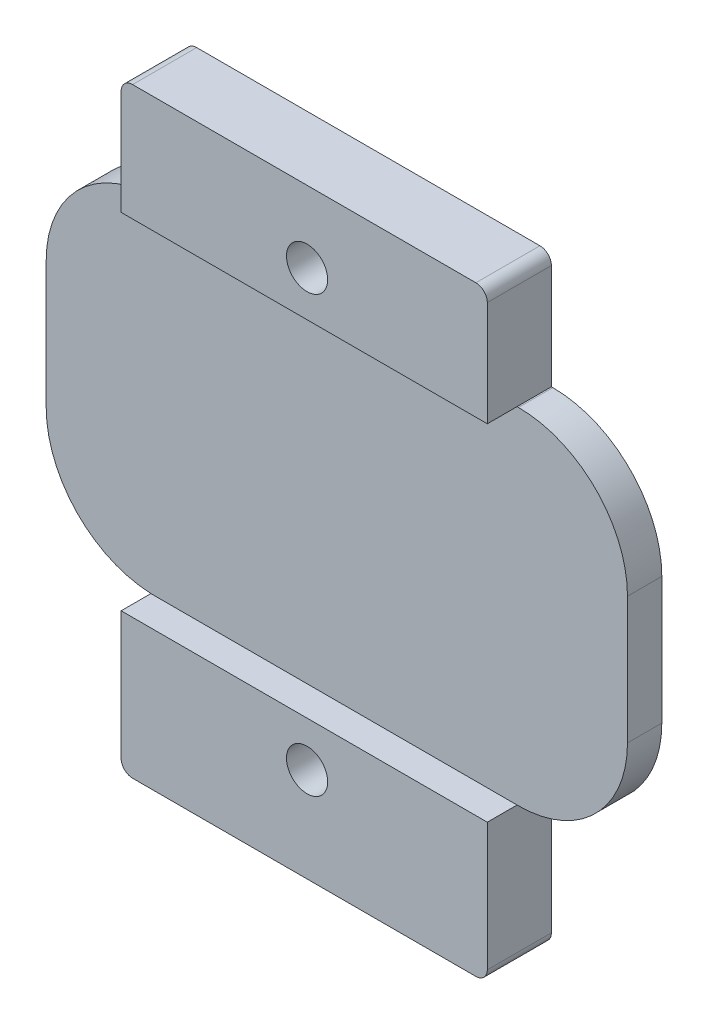
ISO-10303-21;
HEADER;
FILE_DESCRIPTION(('STEP AP214'),'2;1');
FILE_NAME('part.step','',(''),(''),'','','');
FILE_SCHEMA(('AUTOMOTIVE_DESIGN { 1 0 10303 214 1 1 1 1 }'));
ENDSEC;
DATA;
#1=APPLICATION_CONTEXT('core data for automotive mechanical design processes');
#2=APPLICATION_PROTOCOL_DEFINITION('international standard','automotive_design',2000,#1);
#3=PRODUCT_CONTEXT('',#1,'mechanical');
#4=PRODUCT('Part','Part','',(#3));
#5=PRODUCT_RELATED_PRODUCT_CATEGORY('part','',(#4));
#6=PRODUCT_DEFINITION_FORMATION('','',#4);
#7=PRODUCT_DEFINITION_CONTEXT('part definition',#1,'design');
#8=PRODUCT_DEFINITION('design','',#6,#7);
#9=PRODUCT_DEFINITION_SHAPE('','',#8);
#10=(LENGTH_UNIT() NAMED_UNIT(*) SI_UNIT(.MILLI.,.METRE.));
#11=(NAMED_UNIT(*) PLANE_ANGLE_UNIT() SI_UNIT($,.RADIAN.));
#12=(NAMED_UNIT(*) SI_UNIT($,.STERADIAN.) SOLID_ANGLE_UNIT());
#13=UNCERTAINTY_MEASURE_WITH_UNIT(LENGTH_MEASURE(1.E-05),#10,'distance_accuracy_value','');
#14=(GEOMETRIC_REPRESENTATION_CONTEXT(3) GLOBAL_UNCERTAINTY_ASSIGNED_CONTEXT((#13)) GLOBAL_UNIT_ASSIGNED_CONTEXT((#10,
#11,#12)) REPRESENTATION_CONTEXT('',''));
#15=CARTESIAN_POINT('',(0.,0.,0.));
#16=DIRECTION('',(0.,0.,1.));
#17=DIRECTION('',(1.,0.,0.));
#18=AXIS2_PLACEMENT_3D('',#15,#16,#17);
#19=CARTESIAN_POINT('',(-16.2500000005332,12.2500000007962,3.));
#20=DIRECTION('',(1.,0.,0.));
#21=DIRECTION('',(0.,0.,-1.));
#22=AXIS2_PLACEMENT_3D('',#19,#20,#21);
#23=PLANE('',#22);
#24=DIRECTION('',(0.,-1.,0.));
#25=VECTOR('',#24,1.);
#26=CARTESIAN_POINT('',(-16.2500000005332,12.2500000007962,3.));
#27=LINE('',#26,#25);
#28=CARTESIAN_POINT('',(-16.2500000005332,-27.0676152467134,3.));
#29=VERTEX_POINT('',#28);
#30=CARTESIAN_POINT('',(-16.2500000005332,-27.0749999992052,3.));
#31=VERTEX_POINT('',#30);
#32=EDGE_CURVE('E52',#29,#31,#27,.T.);
#33=ORIENTED_EDGE('',*,*,#32,.F.);
#34=DIRECTION('',(0.,0.,1.));
#35=VECTOR('',#34,1.);
#36=CARTESIAN_POINT('',(-16.2500000005332,-27.0676152467134,-59.073263326483));
#37=LINE('',#36,#35);
#38=CARTESIAN_POINT('',(-16.2500000005332,-27.0676152467134,0.));
#39=VERTEX_POINT('',#38);
#40=EDGE_CURVE('E246',#29,#39,#37,.F.);
#41=ORIENTED_EDGE('',*,*,#40,.T.);
#42=DIRECTION('',(0.,-1.,0.));
#43=VECTOR('',#42,1.);
#44=CARTESIAN_POINT('',(-16.2500000005332,12.2500000007962,0.));
#45=LINE('',#44,#43);
#46=CARTESIAN_POINT('',(-16.2500000005332,-38.2499999992031,0.));
#47=VERTEX_POINT('',#46);
#48=EDGE_CURVE('E310',#39,#47,#45,.T.);
#49=ORIENTED_EDGE('',*,*,#48,.T.);
#50=DIRECTION('',(0.,0.,-1.));
#51=VECTOR('',#50,1.);
#52=CARTESIAN_POINT('',(-16.2500000005332,-38.2499999992031,3.));
#53=LINE('',#52,#51);
#54=CARTESIAN_POINT('',(-16.2500000005332,-38.2499999992031,5.6));
#55=VERTEX_POINT('',#54);
#56=EDGE_CURVE('E333',#55,#47,#53,.T.);
#57=ORIENTED_EDGE('',*,*,#56,.F.);
#58=DIRECTION('',(0.,-1.,0.));
#59=VECTOR('',#58,1.);
#60=CARTESIAN_POINT('',(-16.2500000005332,-27.0749999992052,5.6));
#61=LINE('',#60,#59);
#62=CARTESIAN_POINT('',(-16.2500000005332,-27.0749999992052,5.6));
#63=VERTEX_POINT('',#62);
#64=EDGE_CURVE('E264',#63,#55,#61,.T.);
#65=ORIENTED_EDGE('',*,*,#64,.F.);
#66=DIRECTION('',(0.,0.,-1.));
#67=VECTOR('',#66,1.);
#68=CARTESIAN_POINT('',(-16.2500000005332,-27.0749999992052,5.6));
#69=LINE('',#68,#67);
#70=EDGE_CURVE('E267',#63,#31,#69,.T.);
#71=ORIENTED_EDGE('',*,*,#70,.T.);
#72=EDGE_LOOP('',(#33,#41,#49,#57,#65,#71));
#73=FACE_BOUND('',#72,.T.);
#74=ADVANCED_FACE('F35',(#73),#23,.F.);
#75=CARTESIAN_POINT('',(15.75,12.2500000007962,3.));
#76=DIRECTION('',(-1.,0.,0.));
#77=DIRECTION('',(0.,0.,1.));
#78=AXIS2_PLACEMENT_3D('',#75,#76,#77);
#79=PLANE('',#78);
#80=DIRECTION('',(0.,1.,0.));
#81=VECTOR('',#80,1.);
#82=CARTESIAN_POINT('',(15.75,12.2500000007962,0.));
#83=LINE('',#82,#81);
#84=CARTESIAN_POINT('',(15.75,-38.2499999992031,0.));
#85=VERTEX_POINT('',#84);
#86=CARTESIAN_POINT('',(15.75,-27.0749999992052,0.));
#87=VERTEX_POINT('',#86);
#88=EDGE_CURVE('E320',#85,#87,#83,.T.);
#89=ORIENTED_EDGE('',*,*,#88,.T.);
#90=DIRECTION('',(0.,0.,1.));
#91=VECTOR('',#90,1.);
#92=CARTESIAN_POINT('',(15.75,-27.0749999992052,3.));
#93=LINE('',#92,#91);
#94=CARTESIAN_POINT('',(15.75,-27.0749999992052,3.));
#95=VERTEX_POINT('',#94);
#96=EDGE_CURVE('E248',#87,#95,#93,.T.);
#97=ORIENTED_EDGE('',*,*,#96,.T.);
#98=DIRECTION('',(0.,0.,-1.));
#99=VECTOR('',#98,1.);
#100=CARTESIAN_POINT('',(15.75,-27.0749999992052,5.6));
#101=LINE('',#100,#99);
#102=CARTESIAN_POINT('',(15.75,-27.0749999992052,5.6));
#103=VERTEX_POINT('',#102);
#104=EDGE_CURVE('E270',#103,#95,#101,.T.);
#105=ORIENTED_EDGE('',*,*,#104,.F.);
#106=DIRECTION('',(0.,1.,0.));
#107=VECTOR('',#106,1.);
#108=CARTESIAN_POINT('',(15.75,-38.2499999992031,5.6));
#109=LINE('',#108,#107);
#110=CARTESIAN_POINT('',(15.75,-38.2499999992031,5.6));
#111=VERTEX_POINT('',#110);
#112=EDGE_CURVE('E260',#111,#103,#109,.T.);
#113=ORIENTED_EDGE('',*,*,#112,.F.);
#114=DIRECTION('',(0.,0.,-1.));
#115=VECTOR('',#114,1.);
#116=CARTESIAN_POINT('',(15.75,-38.2499999992031,3.));
#117=LINE('',#116,#115);
#118=EDGE_CURVE('E324',#111,#85,#117,.T.);
#119=ORIENTED_EDGE('',*,*,#118,.T.);
#120=EDGE_LOOP('',(#89,#97,#105,#113,#119));
#121=FACE_BOUND('',#120,.T.);
#122=ADVANCED_FACE('F384',(#121),#79,.F.);
#123=CARTESIAN_POINT('',(14.75,12.2500000007962,3.));
#124=DIRECTION('',(0.,0.,1.));
#125=DIRECTION('',(1.,0.,0.));
#126=AXIS2_PLACEMENT_3D('',#123,#124,#125);
#127=PLANE('',#126);
#128=CARTESIAN_POINT('',(-16.2500000005332,3.07500000079476,3.));
#129=VERTEX_POINT('',#128);
#130=CARTESIAN_POINT('',(-16.2500000005332,3.06741524830296,3.));
#131=VERTEX_POINT('',#130);
#132=EDGE_CURVE('E299',#129,#131,#27,.T.);
#133=ORIENTED_EDGE('',*,*,#132,.T.);
#134=CARTESIAN_POINT('',(-15.875,-6.45019999920521,3.));
#135=DIRECTION('',(0.,0.,1.));
#136=DIRECTION('',(1.,0.,0.));
#137=AXIS2_PLACEMENT_3D('',#134,#135,#136);
#138=CIRCLE('',#137,9.52499999999999);
#139=CARTESIAN_POINT('',(-25.4,-6.45019999920524,3.));
#140=VERTEX_POINT('',#139);
#141=EDGE_CURVE('E207',#131,#140,#138,.T.);
#142=ORIENTED_EDGE('',*,*,#141,.T.);
#143=DIRECTION('',(0.,-1.,0.));
#144=VECTOR('',#143,1.);
#145=CARTESIAN_POINT('',(-25.4,-6.45019999920524,3.));
#146=LINE('',#145,#144);
#147=CARTESIAN_POINT('',(-25.4,-17.5499999992052,3.));
#148=VERTEX_POINT('',#147);
#149=EDGE_CURVE('E219',#140,#148,#146,.T.);
#150=ORIENTED_EDGE('',*,*,#149,.T.);
#151=CARTESIAN_POINT('',(-15.875,-17.5499999992052,3.));
#152=DIRECTION('',(0.,0.,1.));
#153=DIRECTION('',(1.,0.,0.));
#154=AXIS2_PLACEMENT_3D('',#151,#152,#153);
#155=CIRCLE('',#154,9.52499999999998);
#156=EDGE_CURVE('E222',#148,#29,#155,.T.);
#157=ORIENTED_EDGE('',*,*,#156,.T.);
#158=ORIENTED_EDGE('',*,*,#32,.T.);
#159=DIRECTION('',(-1.,0.,0.));
#160=VECTOR('',#159,1.);
#161=CARTESIAN_POINT('',(-16.2500000005332,-27.0749999992052,3.));
#162=LINE('',#161,#160);
#163=EDGE_CURVE('E250',#95,#31,#162,.T.);
#164=ORIENTED_EDGE('',*,*,#163,.F.);
#165=DIRECTION('',(1.,0.,0.));
#166=VECTOR('',#165,1.);
#167=CARTESIAN_POINT('',(14.7319999999999,-27.0749999992052,3.));
#168=LINE('',#167,#166);
#169=CARTESIAN_POINT('',(15.875,-27.0749999992052,3.));
#170=VERTEX_POINT('',#169);
#171=EDGE_CURVE('E225',#95,#170,#168,.T.);
#172=ORIENTED_EDGE('',*,*,#171,.T.);
#173=CARTESIAN_POINT('',(15.8749999999999,-17.5499999992052,3.));
#174=DIRECTION('',(0.,0.,1.));
#175=DIRECTION('',(1.,0.,0.));
#176=AXIS2_PLACEMENT_3D('',#173,#174,#175);
#177=CIRCLE('',#176,9.52500000000004);
#178=CARTESIAN_POINT('',(25.4,-17.5499999992052,3.));
#179=VERTEX_POINT('',#178);
#180=EDGE_CURVE('E227',#170,#179,#177,.T.);
#181=ORIENTED_EDGE('',*,*,#180,.T.);
#182=DIRECTION('',(0.,1.,0.));
#183=VECTOR('',#182,1.);
#184=CARTESIAN_POINT('',(25.4,-17.5499999992052,3.));
#185=LINE('',#184,#183);
#186=CARTESIAN_POINT('',(25.4,-6.45019999920519,3.));
#187=VERTEX_POINT('',#186);
#188=EDGE_CURVE('E198',#179,#187,#185,.T.);
#189=ORIENTED_EDGE('',*,*,#188,.T.);
#190=CARTESIAN_POINT('',(15.875,-6.45019999920518,3.));
#191=DIRECTION('',(0.,0.,1.));
#192=DIRECTION('',(1.,0.,0.));
#193=AXIS2_PLACEMENT_3D('',#190,#191,#192);
#194=CIRCLE('',#193,9.52499999999999);
#195=CARTESIAN_POINT('',(15.875,3.0748000007948,3.));
#196=VERTEX_POINT('',#195);
#197=EDGE_CURVE('E192',#187,#196,#194,.T.);
#198=ORIENTED_EDGE('',*,*,#197,.T.);
#199=DIRECTION('',(-1.,0.,0.));
#200=VECTOR('',#199,1.);
#201=CARTESIAN_POINT('',(-14.7320000000001,3.07480000079479,3.));
#202=LINE('',#201,#200);
#203=CARTESIAN_POINT('',(15.75,3.07480000079484,3.));
#204=VERTEX_POINT('',#203);
#205=EDGE_CURVE('E202',#196,#204,#202,.T.);
#206=ORIENTED_EDGE('',*,*,#205,.T.);
#207=DIRECTION('',(0.,1.,0.));
#208=VECTOR('',#207,1.);
#209=CARTESIAN_POINT('',(15.75,12.2500000007962,3.));
#210=LINE('',#209,#208);
#211=CARTESIAN_POINT('',(15.75,3.07500000079476,3.));
#212=VERTEX_POINT('',#211);
#213=EDGE_CURVE('E301',#204,#212,#210,.T.);
#214=ORIENTED_EDGE('',*,*,#213,.T.);
#215=DIRECTION('',(1.,0.,0.));
#216=VECTOR('',#215,1.);
#217=CARTESIAN_POINT('',(-16.2500000005332,3.07500000079476,3.));
#218=LINE('',#217,#216);
#219=EDGE_CURVE('E273',#129,#212,#218,.T.);
#220=ORIENTED_EDGE('',*,*,#219,.F.);
#221=EDGE_LOOP('',(#133,#142,#150,#157,#158,#164,#172,#181,#189,#198,#206,#214,#220));
#222=FACE_BOUND('',#221,.T.);
#223=ADVANCED_FACE('F209',(#222),#127,.T.);
#224=CARTESIAN_POINT('',(14.75,12.2500000007962,3.));
#225=DIRECTION('',(0.,0.,-1.));
#226=DIRECTION('',(-1.,0.,0.));
#227=AXIS2_PLACEMENT_3D('',#224,#225,#226);
#228=CYLINDRICAL_SURFACE('',#227,0.999999999999999);
#229=CARTESIAN_POINT('',(14.75,12.2500000007962,0.));
#230=DIRECTION('',(0.,0.,1.));
#231=DIRECTION('',(1.,0.,0.));
#232=AXIS2_PLACEMENT_3D('',#229,#230,#231);
#233=CIRCLE('',#232,0.999999999999999);
#234=CARTESIAN_POINT('',(15.75,12.2500000007962,0.));
#235=VERTEX_POINT('',#234);
#236=CARTESIAN_POINT('',(14.75,13.2500000007962,0.));
#237=VERTEX_POINT('',#236);
#238=EDGE_CURVE('E298',#235,#237,#233,.T.);
#239=ORIENTED_EDGE('',*,*,#238,.T.);
#240=DIRECTION('',(0.,0.,-1.));
#241=VECTOR('',#240,1.);
#242=CARTESIAN_POINT('',(14.75,13.2500000007962,3.));
#243=LINE('',#242,#241);
#244=CARTESIAN_POINT('',(14.75,13.2500000007962,5.6));
#245=VERTEX_POINT('',#244);
#246=EDGE_CURVE('E11',#245,#237,#243,.T.);
#247=ORIENTED_EDGE('',*,*,#246,.F.);
#248=CARTESIAN_POINT('',(14.75,12.2500000007962,5.6));
#249=DIRECTION('',(0.,0.,1.));
#250=DIRECTION('',(1.,0.,0.));
#251=AXIS2_PLACEMENT_3D('',#248,#249,#250);
#252=CIRCLE('',#251,0.999999999999999);
#253=CARTESIAN_POINT('',(15.75,12.2500000007962,5.6));
#254=VERTEX_POINT('',#253);
#255=EDGE_CURVE('E284',#254,#245,#252,.T.);
#256=ORIENTED_EDGE('',*,*,#255,.F.);
#257=DIRECTION('',(0.,0.,-1.));
#258=VECTOR('',#257,1.);
#259=CARTESIAN_POINT('',(15.75,12.2500000007962,3.));
#260=LINE('',#259,#258);
#261=EDGE_CURVE('E303',#254,#235,#260,.T.);
#262=ORIENTED_EDGE('',*,*,#261,.T.);
#263=EDGE_LOOP('',(#239,#247,#256,#262));
#264=FACE_BOUND('',#263,.T.);
#265=ADVANCED_FACE('F37',(#264),#228,.T.);
#266=CARTESIAN_POINT('',(-15.2500000005332,13.2500000007962,3.));
#267=DIRECTION('',(0.,-1.,0.));
#268=DIRECTION('',(0.,0.,-1.));
#269=AXIS2_PLACEMENT_3D('',#266,#267,#268);
#270=PLANE('',#269);
#271=DIRECTION('',(-1.,0.,0.));
#272=VECTOR('',#271,1.);
#273=CARTESIAN_POINT('',(-15.2500000005332,13.2500000007962,0.));
#274=LINE('',#273,#272);
#275=CARTESIAN_POINT('',(-15.2500000005332,13.2500000007962,0.));
#276=VERTEX_POINT('',#275);
#277=EDGE_CURVE('E306',#237,#276,#274,.T.);
#278=ORIENTED_EDGE('',*,*,#277,.T.);
#279=DIRECTION('',(0.,0.,-1.));
#280=VECTOR('',#279,1.);
#281=CARTESIAN_POINT('',(-15.2500000005332,13.2500000007962,3.));
#282=LINE('',#281,#280);
#283=CARTESIAN_POINT('',(-15.2500000005332,13.2500000007962,5.6));
#284=VERTEX_POINT('',#283);
#285=EDGE_CURVE('E44',#284,#276,#282,.T.);
#286=ORIENTED_EDGE('',*,*,#285,.F.);
#287=DIRECTION('',(-1.,0.,0.));
#288=VECTOR('',#287,1.);
#289=CARTESIAN_POINT('',(14.75,13.2500000007962,5.6));
#290=LINE('',#289,#288);
#291=EDGE_CURVE('E287',#245,#284,#290,.T.);
#292=ORIENTED_EDGE('',*,*,#291,.F.);
#293=ORIENTED_EDGE('',*,*,#246,.T.);
#294=EDGE_LOOP('',(#278,#286,#292,#293));
#295=FACE_BOUND('',#294,.T.);
#296=ADVANCED_FACE('F428',(#295),#270,.F.);
#297=CARTESIAN_POINT('',(-15.2500000005332,12.2500000007962,3.));
#298=DIRECTION('',(0.,0.,-1.));
#299=DIRECTION('',(-1.,0.,0.));
#300=AXIS2_PLACEMENT_3D('',#297,#298,#299);
#301=CYLINDRICAL_SURFACE('',#300,0.999999999999999);
#302=CARTESIAN_POINT('',(-15.2500000005332,12.2500000007962,0.));
#303=DIRECTION('',(0.,0.,1.));
#304=DIRECTION('',(-1.,0.,0.));
#305=AXIS2_PLACEMENT_3D('',#302,#303,#304);
#306=CIRCLE('',#305,0.999999999999999);
#307=CARTESIAN_POINT('',(-16.2500000005332,12.2500000007962,0.));
#308=VERTEX_POINT('',#307);
#309=EDGE_CURVE('E308',#276,#308,#306,.T.);
#310=ORIENTED_EDGE('',*,*,#309,.T.);
#311=DIRECTION('',(0.,0.,-1.));
#312=VECTOR('',#311,1.);
#313=CARTESIAN_POINT('',(-16.2500000005332,12.2500000007962,3.));
#314=LINE('',#313,#312);
#315=CARTESIAN_POINT('',(-16.2500000005332,12.2500000007962,5.6));
#316=VERTEX_POINT('',#315);
#317=EDGE_CURVE('E336',#316,#308,#314,.T.);
#318=ORIENTED_EDGE('',*,*,#317,.F.);
#319=CARTESIAN_POINT('',(-15.2500000005332,12.2500000007962,5.6));
#320=DIRECTION('',(0.,0.,1.));
#321=DIRECTION('',(1.,0.,0.));
#322=AXIS2_PLACEMENT_3D('',#319,#320,#321);
#323=CIRCLE('',#322,1.);
#324=EDGE_CURVE('E274',#284,#316,#323,.T.);
#325=ORIENTED_EDGE('',*,*,#324,.F.);
#326=ORIENTED_EDGE('',*,*,#285,.T.);
#327=EDGE_LOOP('',(#310,#318,#325,#326));
#328=FACE_BOUND('',#327,.T.);
#329=ADVANCED_FACE('F425',(#328),#301,.T.);
#330=CARTESIAN_POINT('',(-16.2500000005332,3.06741524830296,0.));
#331=VERTEX_POINT('',#330);
#332=EDGE_CURVE('E311',#308,#331,#45,.T.);
#333=ORIENTED_EDGE('',*,*,#332,.T.);
#334=DIRECTION('',(0.,0.,1.));
#335=VECTOR('',#334,1.);
#336=CARTESIAN_POINT('',(-16.2500000005332,3.06741524830296,-59.073263326483));
#337=LINE('',#336,#335);
#338=EDGE_CURVE('E60',#331,#131,#337,.T.);
#339=ORIENTED_EDGE('',*,*,#338,.T.);
#340=ORIENTED_EDGE('',*,*,#132,.F.);
#341=DIRECTION('',(0.,0.,-1.));
#342=VECTOR('',#341,1.);
#343=CARTESIAN_POINT('',(-16.2500000005332,3.07500000079476,5.6));
#344=LINE('',#343,#342);
#345=CARTESIAN_POINT('',(-16.2500000005332,3.07500000079476,5.6));
#346=VERTEX_POINT('',#345);
#347=EDGE_CURVE('E295',#346,#129,#344,.T.);
#348=ORIENTED_EDGE('',*,*,#347,.F.);
#349=DIRECTION('',(0.,-1.,0.));
#350=VECTOR('',#349,1.);
#351=CARTESIAN_POINT('',(-16.2500000005332,12.2500000007962,5.6));
#352=LINE('',#351,#350);
#353=EDGE_CURVE('E277',#316,#346,#352,.T.);
#354=ORIENTED_EDGE('',*,*,#353,.F.);
#355=ORIENTED_EDGE('',*,*,#317,.T.);
#356=EDGE_LOOP('',(#333,#339,#340,#348,#354,#355));
#357=FACE_BOUND('',#356,.T.);
#358=ADVANCED_FACE('F420',(#357),#23,.F.);
#359=CARTESIAN_POINT('',(-15.2500000005332,-38.2499999992031,3.));
#360=DIRECTION('',(0.,0.,-1.));
#361=DIRECTION('',(-1.,0.,0.));
#362=AXIS2_PLACEMENT_3D('',#359,#360,#361);
#363=CYLINDRICAL_SURFACE('',#362,1.);
#364=CARTESIAN_POINT('',(-15.2500000005332,-38.2499999992031,0.));
#365=DIRECTION('',(0.,0.,1.));
#366=DIRECTION('',(1.,0.,0.));
#367=AXIS2_PLACEMENT_3D('',#364,#365,#366);
#368=CIRCLE('',#367,1.);
#369=CARTESIAN_POINT('',(-15.2500000005332,-39.2499999992031,0.));
#370=VERTEX_POINT('',#369);
#371=EDGE_CURVE('E313',#47,#370,#368,.T.);
#372=ORIENTED_EDGE('',*,*,#371,.T.);
#373=DIRECTION('',(0.,0.,-1.));
#374=VECTOR('',#373,1.);
#375=CARTESIAN_POINT('',(-15.2500000005332,-39.2499999992031,3.));
#376=LINE('',#375,#374);
#377=CARTESIAN_POINT('',(-15.2500000005332,-39.2499999992031,5.6));
#378=VERTEX_POINT('',#377);
#379=EDGE_CURVE('E330',#378,#370,#376,.T.);
#380=ORIENTED_EDGE('',*,*,#379,.F.);
#381=CARTESIAN_POINT('',(-15.2500000005332,-38.2499999992031,5.6));
#382=DIRECTION('',(0.,0.,1.));
#383=DIRECTION('',(1.,0.,0.));
#384=AXIS2_PLACEMENT_3D('',#381,#382,#383);
#385=CIRCLE('',#384,1.);
#386=EDGE_CURVE('E251',#55,#378,#385,.T.);
#387=ORIENTED_EDGE('',*,*,#386,.F.);
#388=ORIENTED_EDGE('',*,*,#56,.T.);
#389=EDGE_LOOP('',(#372,#380,#387,#388));
#390=FACE_BOUND('',#389,.T.);
#391=ADVANCED_FACE('F398',(#390),#363,.T.);
#392=CARTESIAN_POINT('',(14.75,-39.2499999992031,3.));
#393=DIRECTION('',(0.,1.,0.));
#394=DIRECTION('',(-1.,0.,0.));
#395=AXIS2_PLACEMENT_3D('',#392,#393,#394);
#396=PLANE('',#395);
#397=DIRECTION('',(1.,0.,0.));
#398=VECTOR('',#397,1.);
#399=CARTESIAN_POINT('',(14.75,-39.2499999992031,0.));
#400=LINE('',#399,#398);
#401=CARTESIAN_POINT('',(14.75,-39.2499999992031,0.));
#402=VERTEX_POINT('',#401);
#403=EDGE_CURVE('E315',#370,#402,#400,.T.);
#404=ORIENTED_EDGE('',*,*,#403,.T.);
#405=DIRECTION('',(0.,0.,-1.));
#406=VECTOR('',#405,1.);
#407=CARTESIAN_POINT('',(14.75,-39.2499999992031,3.));
#408=LINE('',#407,#406);
#409=CARTESIAN_POINT('',(14.75,-39.2499999992031,5.6));
#410=VERTEX_POINT('',#409);
#411=EDGE_CURVE('E327',#410,#402,#408,.T.);
#412=ORIENTED_EDGE('',*,*,#411,.F.);
#413=DIRECTION('',(1.,0.,0.));
#414=VECTOR('',#413,1.);
#415=CARTESIAN_POINT('',(-15.2500000005332,-39.2499999992031,5.6));
#416=LINE('',#415,#414);
#417=EDGE_CURVE('E254',#378,#410,#416,.T.);
#418=ORIENTED_EDGE('',*,*,#417,.F.);
#419=ORIENTED_EDGE('',*,*,#379,.T.);
#420=EDGE_LOOP('',(#404,#412,#418,#419));
#421=FACE_BOUND('',#420,.T.);
#422=ADVANCED_FACE('F395',(#421),#396,.F.);
#423=CARTESIAN_POINT('',(14.75,-38.2499999992031,3.));
#424=DIRECTION('',(0.,0.,-1.));
#425=DIRECTION('',(-1.,0.,0.));
#426=AXIS2_PLACEMENT_3D('',#423,#424,#425);
#427=CYLINDRICAL_SURFACE('',#426,1.);
#428=CARTESIAN_POINT('',(14.75,-38.2499999992031,0.));
#429=DIRECTION('',(0.,0.,1.));
#430=DIRECTION('',(1.,0.,0.));
#431=AXIS2_PLACEMENT_3D('',#428,#429,#430);
#432=CIRCLE('',#431,1.);
#433=EDGE_CURVE('E317',#402,#85,#432,.T.);
#434=ORIENTED_EDGE('',*,*,#433,.T.);
#435=ORIENTED_EDGE('',*,*,#118,.F.);
#436=CARTESIAN_POINT('',(14.75,-38.2499999992031,5.6));
#437=DIRECTION('',(0.,0.,1.));
#438=DIRECTION('',(1.,0.,0.));
#439=AXIS2_PLACEMENT_3D('',#436,#437,#438);
#440=CIRCLE('',#439,1.);
#441=EDGE_CURVE('E257',#410,#111,#440,.T.);
#442=ORIENTED_EDGE('',*,*,#441,.F.);
#443=ORIENTED_EDGE('',*,*,#411,.T.);
#444=EDGE_LOOP('',(#434,#435,#442,#443));
#445=FACE_BOUND('',#444,.T.);
#446=ADVANCED_FACE('F389',(#445),#427,.T.);
#447=ORIENTED_EDGE('',*,*,#213,.F.);
#448=DIRECTION('',(0.,0.,-1.));
#449=VECTOR('',#448,1.);
#450=CARTESIAN_POINT('',(15.75,3.07480000079479,3.));
#451=LINE('',#450,#449);
#452=CARTESIAN_POINT('',(15.75,3.07480000079479,0.));
#453=VERTEX_POINT('',#452);
#454=EDGE_CURVE('E205',#204,#453,#451,.T.);
#455=ORIENTED_EDGE('',*,*,#454,.T.);
#456=EDGE_CURVE('E319',#453,#235,#83,.T.);
#457=ORIENTED_EDGE('',*,*,#456,.T.);
#458=ORIENTED_EDGE('',*,*,#261,.F.);
#459=DIRECTION('',(0.,1.,0.));
#460=VECTOR('',#459,1.);
#461=CARTESIAN_POINT('',(15.75,3.07500000079476,5.6));
#462=LINE('',#461,#460);
#463=CARTESIAN_POINT('',(15.75,3.07500000079476,5.6));
#464=VERTEX_POINT('',#463);
#465=EDGE_CURVE('E281',#464,#254,#462,.T.);
#466=ORIENTED_EDGE('',*,*,#465,.F.);
#467=DIRECTION('',(0.,0.,-1.));
#468=VECTOR('',#467,1.);
#469=CARTESIAN_POINT('',(15.75,3.07500000079476,5.6));
#470=LINE('',#469,#468);
#471=EDGE_CURVE('E290',#464,#212,#470,.T.);
#472=ORIENTED_EDGE('',*,*,#471,.T.);
#473=EDGE_LOOP('',(#447,#455,#457,#458,#466,#472));
#474=FACE_BOUND('',#473,.T.);
#475=ADVANCED_FACE('F436',(#474),#79,.F.);
#476=CARTESIAN_POINT('',(14.75,12.2500000007962,0.));
#477=DIRECTION('',(0.,0.,1.));
#478=DIRECTION('',(1.,0.,0.));
#479=AXIS2_PLACEMENT_3D('',#476,#477,#478);
#480=PLANE('',#479);
#481=CARTESIAN_POINT('',(0.,6.99999999999999,0.));
#482=DIRECTION('',(0.,0.,1.));
#483=DIRECTION('',(1.,0.,0.));
#484=AXIS2_PLACEMENT_3D('',#481,#482,#483);
#485=CIRCLE('',#484,1.8);
#486=CARTESIAN_POINT('',(1.80000000000002,6.99999999999999,0.));
#487=VERTEX_POINT('',#486);
#488=EDGE_CURVE('E341',#487,#487,#485,.T.);
#489=ORIENTED_EDGE('',*,*,#488,.T.);
#490=EDGE_LOOP('',(#489));
#491=FACE_BOUND('',#490,.T.);
#492=CARTESIAN_POINT('',(0.,-31.,0.));
#493=DIRECTION('',(0.,0.,1.));
#494=DIRECTION('',(1.,0.,0.));
#495=AXIS2_PLACEMENT_3D('',#492,#493,#494);
#496=CIRCLE('',#495,1.8);
#497=CARTESIAN_POINT('',(1.8,-31.,0.));
#498=VERTEX_POINT('',#497);
#499=EDGE_CURVE('E345',#498,#498,#496,.T.);
#500=ORIENTED_EDGE('',*,*,#499,.T.);
#501=EDGE_LOOP('',(#500));
#502=FACE_BOUND('',#501,.T.);
#503=ORIENTED_EDGE('',*,*,#456,.F.);
#504=DIRECTION('',(1.,0.,0.));
#505=VECTOR('',#504,1.);
#506=CARTESIAN_POINT('',(-14.7320000000001,3.07480000079479,0.));
#507=LINE('',#506,#505);
#508=CARTESIAN_POINT('',(15.875,3.07480000079479,0.));
#509=VERTEX_POINT('',#508);
#510=EDGE_CURVE('E242',#453,#509,#507,.T.);
#511=ORIENTED_EDGE('',*,*,#510,.T.);
#512=CARTESIAN_POINT('',(15.875,-6.45019999920518,0.));
#513=DIRECTION('',(0.,0.,1.));
#514=DIRECTION('',(1.,0.,0.));
#515=AXIS2_PLACEMENT_3D('',#512,#513,#514);
#516=CIRCLE('',#515,9.52499999999999);
#517=CARTESIAN_POINT('',(25.4,-6.45019999920519,0.));
#518=VERTEX_POINT('',#517);
#519=EDGE_CURVE('E194',#509,#518,#516,.F.);
#520=ORIENTED_EDGE('',*,*,#519,.T.);
#521=DIRECTION('',(0.,-1.,0.));
#522=VECTOR('',#521,1.);
#523=CARTESIAN_POINT('',(25.4,-17.5499999992052,0.));
#524=LINE('',#523,#522);
#525=CARTESIAN_POINT('',(25.4,-17.5499999992052,0.));
#526=VERTEX_POINT('',#525);
#527=EDGE_CURVE('E362',#518,#526,#524,.T.);
#528=ORIENTED_EDGE('',*,*,#527,.T.);
#529=CARTESIAN_POINT('',(15.8749999999999,-17.5499999992052,0.));
#530=DIRECTION('',(0.,0.,1.));
#531=DIRECTION('',(1.,0.,0.));
#532=AXIS2_PLACEMENT_3D('',#529,#530,#531);
#533=CIRCLE('',#532,9.52500000000004);
#534=CARTESIAN_POINT('',(15.875,-27.0749999992052,0.));
#535=VERTEX_POINT('',#534);
#536=EDGE_CURVE('E361',#526,#535,#533,.F.);
#537=ORIENTED_EDGE('',*,*,#536,.T.);
#538=DIRECTION('',(-1.,0.,0.));
#539=VECTOR('',#538,1.);
#540=CARTESIAN_POINT('',(14.7319999999999,-27.0749999992052,0.));
#541=LINE('',#540,#539);
#542=EDGE_CURVE('E358',#535,#87,#541,.T.);
#543=ORIENTED_EDGE('',*,*,#542,.T.);
#544=ORIENTED_EDGE('',*,*,#88,.F.);
#545=ORIENTED_EDGE('',*,*,#433,.F.);
#546=ORIENTED_EDGE('',*,*,#403,.F.);
#547=ORIENTED_EDGE('',*,*,#371,.F.);
#548=ORIENTED_EDGE('',*,*,#48,.F.);
#549=CARTESIAN_POINT('',(-15.875,-17.5499999992052,0.));
#550=DIRECTION('',(0.,0.,1.));
#551=DIRECTION('',(1.,0.,0.));
#552=AXIS2_PLACEMENT_3D('',#549,#550,#551);
#553=CIRCLE('',#552,9.52499999999998);
#554=CARTESIAN_POINT('',(-25.4,-17.5499999992052,0.));
#555=VERTEX_POINT('',#554);
#556=EDGE_CURVE('E356',#39,#555,#553,.F.);
#557=ORIENTED_EDGE('',*,*,#556,.T.);
#558=DIRECTION('',(0.,1.,0.));
#559=VECTOR('',#558,1.);
#560=CARTESIAN_POINT('',(-25.4,-6.45019999920524,0.));
#561=LINE('',#560,#559);
#562=CARTESIAN_POINT('',(-25.4,-6.45019999920524,0.));
#563=VERTEX_POINT('',#562);
#564=EDGE_CURVE('E354',#555,#563,#561,.T.);
#565=ORIENTED_EDGE('',*,*,#564,.T.);
#566=CARTESIAN_POINT('',(-15.875,-6.45019999920521,0.));
#567=DIRECTION('',(0.,0.,1.));
#568=DIRECTION('',(1.,0.,0.));
#569=AXIS2_PLACEMENT_3D('',#566,#567,#568);
#570=CIRCLE('',#569,9.52499999999999);
#571=EDGE_CURVE('E232',#563,#331,#570,.F.);
#572=ORIENTED_EDGE('',*,*,#571,.T.);
#573=ORIENTED_EDGE('',*,*,#332,.F.);
#574=ORIENTED_EDGE('',*,*,#309,.F.);
#575=ORIENTED_EDGE('',*,*,#277,.F.);
#576=ORIENTED_EDGE('',*,*,#238,.F.);
#577=EDGE_LOOP('',(#503,#511,#520,#528,#537,#543,#544,#545,#546,#547,#548,#557,#565,#572,#573,
#574,#575,#576));
#578=FACE_BOUND('',#577,.T.);
#579=ADVANCED_FACE('F366',(#491,#502,#578),#480,.F.);
#580=CARTESIAN_POINT('',(-16.2500000005332,3.07500000079476,5.6));
#581=DIRECTION('',(0.,1.,0.));
#582=DIRECTION('',(0.,0.,1.));
#583=AXIS2_PLACEMENT_3D('',#580,#581,#582);
#584=PLANE('',#583);
#585=ORIENTED_EDGE('',*,*,#219,.T.);
#586=ORIENTED_EDGE('',*,*,#471,.F.);
#587=DIRECTION('',(1.,0.,0.));
#588=VECTOR('',#587,1.);
#589=CARTESIAN_POINT('',(-16.2500000005332,3.07500000079476,5.6));
#590=LINE('',#589,#588);
#591=EDGE_CURVE('E279',#346,#464,#590,.T.);
#592=ORIENTED_EDGE('',*,*,#591,.F.);
#593=ORIENTED_EDGE('',*,*,#347,.T.);
#594=EDGE_LOOP('',(#585,#586,#592,#593));
#595=FACE_BOUND('',#594,.T.);
#596=ADVANCED_FACE('F439',(#595),#584,.F.);
#597=CARTESIAN_POINT('',(-15.2500000005332,12.2500000007962,5.6));
#598=DIRECTION('',(0.,0.,1.));
#599=DIRECTION('',(1.,0.,0.));
#600=AXIS2_PLACEMENT_3D('',#597,#598,#599);
#601=PLANE('',#600);
#602=CARTESIAN_POINT('',(0.,6.99999999999999,5.6));
#603=DIRECTION('',(0.,0.,1.));
#604=DIRECTION('',(1.,0.,0.));
#605=AXIS2_PLACEMENT_3D('',#602,#603,#604);
#606=CIRCLE('',#605,1.8);
#607=CARTESIAN_POINT('',(1.80000000000002,6.99999999999999,5.6));
#608=VERTEX_POINT('',#607);
#609=EDGE_CURVE('E39',#608,#608,#606,.F.);
#610=ORIENTED_EDGE('',*,*,#609,.T.);
#611=EDGE_LOOP('',(#610));
#612=FACE_BOUND('',#611,.T.);
#613=ORIENTED_EDGE('',*,*,#324,.T.);
#614=ORIENTED_EDGE('',*,*,#353,.T.);
#615=ORIENTED_EDGE('',*,*,#591,.T.);
#616=ORIENTED_EDGE('',*,*,#465,.T.);
#617=ORIENTED_EDGE('',*,*,#255,.T.);
#618=ORIENTED_EDGE('',*,*,#291,.T.);
#619=EDGE_LOOP('',(#613,#614,#615,#616,#617,#618));
#620=FACE_BOUND('',#619,.T.);
#621=ADVANCED_FACE('F430',(#612,#620),#601,.T.);
#622=CARTESIAN_POINT('',(-16.2500000005332,-27.0749999992052,5.6));
#623=DIRECTION('',(0.,-1.,0.));
#624=DIRECTION('',(0.,0.,-1.));
#625=AXIS2_PLACEMENT_3D('',#622,#623,#624);
#626=PLANE('',#625);
#627=ORIENTED_EDGE('',*,*,#163,.T.);
#628=ORIENTED_EDGE('',*,*,#70,.F.);
#629=DIRECTION('',(-1.,0.,0.));
#630=VECTOR('',#629,1.);
#631=CARTESIAN_POINT('',(-16.2500000005332,-27.0749999992052,5.6));
#632=LINE('',#631,#630);
#633=EDGE_CURVE('E262',#103,#63,#632,.T.);
#634=ORIENTED_EDGE('',*,*,#633,.F.);
#635=ORIENTED_EDGE('',*,*,#104,.T.);
#636=EDGE_LOOP('',(#627,#628,#634,#635));
#637=FACE_BOUND('',#636,.T.);
#638=ADVANCED_FACE('F403',(#637),#626,.F.);
#639=CARTESIAN_POINT('',(-15.2500000005332,-38.2499999992031,5.6));
#640=DIRECTION('',(0.,0.,1.));
#641=DIRECTION('',(1.,0.,0.));
#642=AXIS2_PLACEMENT_3D('',#639,#640,#641);
#643=PLANE('',#642);
#644=CARTESIAN_POINT('',(0.,-31.,5.6));
#645=DIRECTION('',(0.,0.,1.));
#646=DIRECTION('',(1.,0.,0.));
#647=AXIS2_PLACEMENT_3D('',#644,#645,#646);
#648=CIRCLE('',#647,1.8);
#649=CARTESIAN_POINT('',(1.8,-31.,5.6));
#650=VERTEX_POINT('',#649);
#651=EDGE_CURVE('E214',#650,#650,#648,.F.);
#652=ORIENTED_EDGE('',*,*,#651,.T.);
#653=EDGE_LOOP('',(#652));
#654=FACE_BOUND('',#653,.T.);
#655=ORIENTED_EDGE('',*,*,#386,.T.);
#656=ORIENTED_EDGE('',*,*,#417,.T.);
#657=ORIENTED_EDGE('',*,*,#441,.T.);
#658=ORIENTED_EDGE('',*,*,#112,.T.);
#659=ORIENTED_EDGE('',*,*,#633,.T.);
#660=ORIENTED_EDGE('',*,*,#64,.T.);
#661=EDGE_LOOP('',(#655,#656,#657,#658,#659,#660));
#662=FACE_BOUND('',#661,.T.);
#663=ADVANCED_FACE('F391',(#654,#662),#643,.T.);
#664=CARTESIAN_POINT('',(15.8749999999999,-17.5499999992052,-59.073263326483));
#665=DIRECTION('',(0.,0.,1.));
#666=DIRECTION('',(1.,0.,0.));
#667=AXIS2_PLACEMENT_3D('',#664,#665,#666);
#668=CYLINDRICAL_SURFACE('',#667,9.52500000000004);
#669=ORIENTED_EDGE('',*,*,#536,.F.);
#670=DIRECTION('',(0.,0.,1.));
#671=VECTOR('',#670,1.);
#672=CARTESIAN_POINT('',(25.4,-17.5499999992052,-59.073263326483));
#673=LINE('',#672,#671);
#674=EDGE_CURVE('E233',#526,#179,#673,.T.);
#675=ORIENTED_EDGE('',*,*,#674,.T.);
#676=ORIENTED_EDGE('',*,*,#180,.F.);
#677=DIRECTION('',(0.,0.,1.));
#678=VECTOR('',#677,1.);
#679=CARTESIAN_POINT('',(15.875,-27.0749999992052,-59.073263326483));
#680=LINE('',#679,#678);
#681=EDGE_CURVE('E235',#535,#170,#680,.T.);
#682=ORIENTED_EDGE('',*,*,#681,.F.);
#683=EDGE_LOOP('',(#669,#675,#676,#682));
#684=FACE_BOUND('',#683,.T.);
#685=ADVANCED_FACE('F372',(#684),#668,.T.);
#686=CARTESIAN_POINT('',(25.4,-17.5499999992052,-59.073263326483));
#687=DIRECTION('',(1.,0.,0.));
#688=DIRECTION('',(0.,1.,0.));
#689=AXIS2_PLACEMENT_3D('',#686,#687,#688);
#690=PLANE('',#689);
#691=ORIENTED_EDGE('',*,*,#527,.F.);
#692=DIRECTION('',(0.,0.,1.));
#693=VECTOR('',#692,1.);
#694=CARTESIAN_POINT('',(25.4,-6.45019999920519,-59.073263326483));
#695=LINE('',#694,#693);
#696=EDGE_CURVE('E230',#518,#187,#695,.T.);
#697=ORIENTED_EDGE('',*,*,#696,.T.);
#698=ORIENTED_EDGE('',*,*,#188,.F.);
#699=ORIENTED_EDGE('',*,*,#674,.F.);
#700=EDGE_LOOP('',(#691,#697,#698,#699));
#701=FACE_BOUND('',#700,.T.);
#702=ADVANCED_FACE('F369',(#701),#690,.T.);
#703=CARTESIAN_POINT('',(15.875,-6.45019999920518,-59.073263326483));
#704=DIRECTION('',(0.,0.,1.));
#705=DIRECTION('',(1.,0.,0.));
#706=AXIS2_PLACEMENT_3D('',#703,#704,#705);
#707=CYLINDRICAL_SURFACE('',#706,9.52499999999999);
#708=ORIENTED_EDGE('',*,*,#519,.F.);
#709=DIRECTION('',(0.,0.,1.));
#710=VECTOR('',#709,1.);
#711=CARTESIAN_POINT('',(15.875,3.0748000007948,-59.073263326483));
#712=LINE('',#711,#710);
#713=EDGE_CURVE('E187',#509,#196,#712,.T.);
#714=ORIENTED_EDGE('',*,*,#713,.T.);
#715=ORIENTED_EDGE('',*,*,#197,.F.);
#716=ORIENTED_EDGE('',*,*,#696,.F.);
#717=EDGE_LOOP('',(#708,#714,#715,#716));
#718=FACE_BOUND('',#717,.T.);
#719=ADVANCED_FACE('F189',(#718),#707,.T.);
#720=CARTESIAN_POINT('',(-14.7320000000001,3.07480000079479,-59.073263326483));
#721=DIRECTION('',(0.,1.,0.));
#722=DIRECTION('',(0.,0.,1.));
#723=AXIS2_PLACEMENT_3D('',#720,#721,#722);
#724=PLANE('',#723);
#725=ORIENTED_EDGE('',*,*,#454,.F.);
#726=ORIENTED_EDGE('',*,*,#205,.F.);
#727=ORIENTED_EDGE('',*,*,#713,.F.);
#728=ORIENTED_EDGE('',*,*,#510,.F.);
#729=EDGE_LOOP('',(#725,#726,#727,#728));
#730=FACE_BOUND('',#729,.T.);
#731=ADVANCED_FACE('F203',(#730),#724,.T.);
#732=CARTESIAN_POINT('',(14.7319999999999,-27.0749999992052,-59.073263326483));
#733=DIRECTION('',(0.,-1.,0.));
#734=DIRECTION('',(0.,0.,-1.));
#735=AXIS2_PLACEMENT_3D('',#732,#733,#734);
#736=PLANE('',#735);
#737=ORIENTED_EDGE('',*,*,#96,.F.);
#738=ORIENTED_EDGE('',*,*,#542,.F.);
#739=ORIENTED_EDGE('',*,*,#681,.T.);
#740=ORIENTED_EDGE('',*,*,#171,.F.);
#741=EDGE_LOOP('',(#737,#738,#739,#740));
#742=FACE_BOUND('',#741,.T.);
#743=ADVANCED_FACE('F379',(#742),#736,.T.);
#744=CARTESIAN_POINT('',(-15.875,-17.5499999992052,-59.073263326483));
#745=DIRECTION('',(0.,0.,1.));
#746=DIRECTION('',(1.,0.,0.));
#747=AXIS2_PLACEMENT_3D('',#744,#745,#746);
#748=CYLINDRICAL_SURFACE('',#747,9.52499999999998);
#749=ORIENTED_EDGE('',*,*,#40,.F.);
#750=ORIENTED_EDGE('',*,*,#156,.F.);
#751=DIRECTION('',(0.,0.,1.));
#752=VECTOR('',#751,1.);
#753=CARTESIAN_POINT('',(-25.4,-17.5499999992052,-59.073263326483));
#754=LINE('',#753,#752);
#755=EDGE_CURVE('E238',#555,#148,#754,.T.);
#756=ORIENTED_EDGE('',*,*,#755,.F.);
#757=ORIENTED_EDGE('',*,*,#556,.F.);
#758=EDGE_LOOP('',(#749,#750,#756,#757));
#759=FACE_BOUND('',#758,.T.);
#760=ADVANCED_FACE('F408',(#759),#748,.T.);
#761=CARTESIAN_POINT('',(-15.875,-6.45019999920521,-59.073263326483));
#762=DIRECTION('',(0.,0.,1.));
#763=DIRECTION('',(1.,0.,0.));
#764=AXIS2_PLACEMENT_3D('',#761,#762,#763);
#765=CYLINDRICAL_SURFACE('',#764,9.52499999999999);
#766=ORIENTED_EDGE('',*,*,#338,.F.);
#767=ORIENTED_EDGE('',*,*,#571,.F.);
#768=DIRECTION('',(0.,0.,1.));
#769=VECTOR('',#768,1.);
#770=CARTESIAN_POINT('',(-25.4,-6.45019999920524,-59.073263326483));
#771=LINE('',#770,#769);
#772=EDGE_CURVE('E197',#563,#140,#771,.T.);
#773=ORIENTED_EDGE('',*,*,#772,.T.);
#774=ORIENTED_EDGE('',*,*,#141,.F.);
#775=EDGE_LOOP('',(#766,#767,#773,#774));
#776=FACE_BOUND('',#775,.T.);
#777=ADVANCED_FACE('F417',(#776),#765,.T.);
#778=CARTESIAN_POINT('',(-25.4,-6.45019999920524,-59.073263326483));
#779=DIRECTION('',(-1.,0.,0.));
#780=DIRECTION('',(0.,0.,1.));
#781=AXIS2_PLACEMENT_3D('',#778,#779,#780);
#782=PLANE('',#781);
#783=ORIENTED_EDGE('',*,*,#564,.F.);
#784=ORIENTED_EDGE('',*,*,#755,.T.);
#785=ORIENTED_EDGE('',*,*,#149,.F.);
#786=ORIENTED_EDGE('',*,*,#772,.F.);
#787=EDGE_LOOP('',(#783,#784,#785,#786));
#788=FACE_BOUND('',#787,.T.);
#789=ADVANCED_FACE('F414',(#788),#782,.T.);
#790=CARTESIAN_POINT('',(0.,-31.,8.));
#791=DIRECTION('',(0.,0.,-1.));
#792=DIRECTION('',(-1.,0.,0.));
#793=AXIS2_PLACEMENT_3D('',#790,#791,#792);
#794=CYLINDRICAL_SURFACE('',#793,1.8);
#795=ORIENTED_EDGE('',*,*,#651,.F.);
#796=EDGE_LOOP('',(#795));
#797=FACE_BOUND('',#796,.T.);
#798=ORIENTED_EDGE('',*,*,#499,.F.);
#799=EDGE_LOOP('',(#798));
#800=FACE_BOUND('',#799,.T.);
#801=ADVANCED_FACE('F529',(#797,#800),#794,.F.);
#802=CARTESIAN_POINT('',(0.,6.99999999999999,8.));
#803=DIRECTION('',(0.,0.,-1.));
#804=DIRECTION('',(-1.,0.,0.));
#805=AXIS2_PLACEMENT_3D('',#802,#803,#804);
#806=CYLINDRICAL_SURFACE('',#805,1.8);
#807=ORIENTED_EDGE('',*,*,#609,.F.);
#808=EDGE_LOOP('',(#807));
#809=FACE_BOUND('',#808,.T.);
#810=ORIENTED_EDGE('',*,*,#488,.F.);
#811=EDGE_LOOP('',(#810));
#812=FACE_BOUND('',#811,.T.);
#813=ADVANCED_FACE('F534',(#809,#812),#806,.F.);
#814=CLOSED_SHELL('',(#74,#122,#223,#265,#296,#329,#358,#391,#422,#446,#475,#579,#596,#621,#638,
#663,#685,#702,#719,#731,#743,#760,#777,#789,#801,#813));
#815=MANIFOLD_SOLID_BREP('B2',#814);
#816=ADVANCED_BREP_SHAPE_REPRESENTATION('',(#18,#815),#14);
#817=SHAPE_DEFINITION_REPRESENTATION(#9,#816);
ENDSEC;
END-ISO-10303-21;
